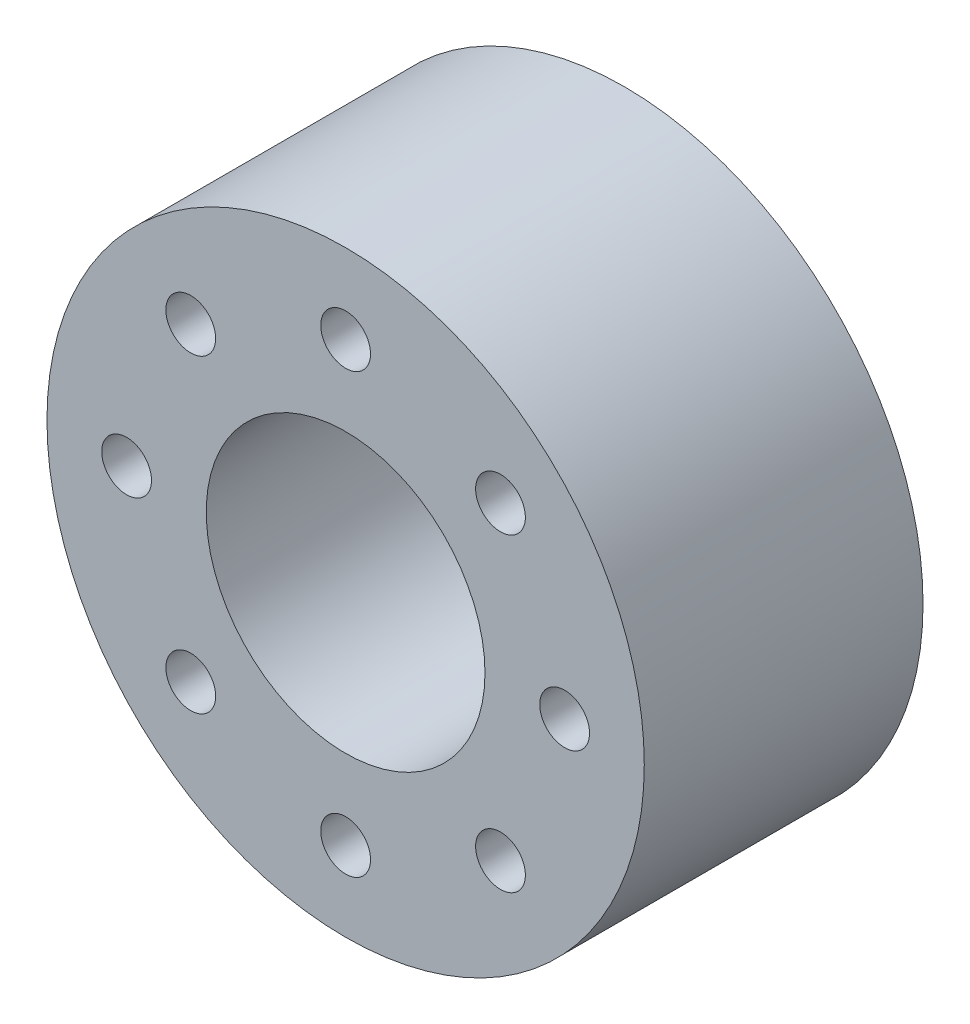
ISO-10303-21;
HEADER;
FILE_DESCRIPTION(('STEP AP214'),'2;1');
FILE_NAME('part.step','',(''),(''),'','','');
FILE_SCHEMA(('AUTOMOTIVE_DESIGN { 1 0 10303 214 1 1 1 1 }'));
ENDSEC;
DATA;
#1=APPLICATION_CONTEXT('core data for automotive mechanical design processes');
#2=APPLICATION_PROTOCOL_DEFINITION('international standard','automotive_design',2000,#1);
#3=PRODUCT_CONTEXT('',#1,'mechanical');
#4=PRODUCT('Part','Part','',(#3));
#5=PRODUCT_RELATED_PRODUCT_CATEGORY('part','',(#4));
#6=PRODUCT_DEFINITION_FORMATION('','',#4);
#7=PRODUCT_DEFINITION_CONTEXT('part definition',#1,'design');
#8=PRODUCT_DEFINITION('design','',#6,#7);
#9=PRODUCT_DEFINITION_SHAPE('','',#8);
#10=(LENGTH_UNIT() NAMED_UNIT(*) SI_UNIT(.MILLI.,.METRE.));
#11=(NAMED_UNIT(*) PLANE_ANGLE_UNIT() SI_UNIT($,.RADIAN.));
#12=(NAMED_UNIT(*) SI_UNIT($,.STERADIAN.) SOLID_ANGLE_UNIT());
#13=UNCERTAINTY_MEASURE_WITH_UNIT(LENGTH_MEASURE(1.E-05),#10,'distance_accuracy_value','');
#14=(GEOMETRIC_REPRESENTATION_CONTEXT(3) GLOBAL_UNCERTAINTY_ASSIGNED_CONTEXT((#13)) GLOBAL_UNIT_ASSIGNED_CONTEXT((#10,
#11,#12)) REPRESENTATION_CONTEXT('',''));
#15=CARTESIAN_POINT('',(0.,0.,0.));
#16=DIRECTION('',(0.,0.,1.));
#17=DIRECTION('',(1.,0.,0.));
#18=AXIS2_PLACEMENT_3D('',#15,#16,#17);
#19=CARTESIAN_POINT('',(0.,0.,7.));
#20=DIRECTION('',(0.,0.,1.));
#21=DIRECTION('',(1.,0.,0.));
#22=AXIS2_PLACEMENT_3D('',#19,#20,#21);
#23=PLANE('',#22);
#24=CARTESIAN_POINT('',(-11.,0.,7.));
#25=DIRECTION('',(0.,0.,1.));
#26=DIRECTION('',(1.,0.,0.));
#27=AXIS2_PLACEMENT_3D('',#24,#25,#26);
#28=CIRCLE('',#27,1.25000000000011);
#29=CARTESIAN_POINT('',(-9.74999999999989,0.,7.));
#30=VERTEX_POINT('',#29);
#31=EDGE_CURVE('E82',#30,#30,#28,.T.);
#32=ORIENTED_EDGE('',*,*,#31,.F.);
#33=EDGE_LOOP('',(#32));
#34=FACE_BOUND('',#33,.T.);
#35=CARTESIAN_POINT('',(0.,-11.,7.));
#36=DIRECTION('',(0.,0.,1.));
#37=DIRECTION('',(1.,0.,0.));
#38=AXIS2_PLACEMENT_3D('',#35,#36,#37);
#39=CIRCLE('',#38,1.25000000000007);
#40=CARTESIAN_POINT('',(1.25000000000007,-11.,7.));
#41=VERTEX_POINT('',#40);
#42=EDGE_CURVE('E70',#41,#41,#39,.T.);
#43=ORIENTED_EDGE('',*,*,#42,.F.);
#44=EDGE_LOOP('',(#43));
#45=FACE_BOUND('',#44,.T.);
#46=CARTESIAN_POINT('',(11.,0.,7.));
#47=DIRECTION('',(0.,0.,1.));
#48=DIRECTION('',(1.,0.,0.));
#49=AXIS2_PLACEMENT_3D('',#46,#47,#48);
#50=CIRCLE('',#49,1.25000000000004);
#51=CARTESIAN_POINT('',(12.25,0.,7.));
#52=VERTEX_POINT('',#51);
#53=EDGE_CURVE('E58',#52,#52,#50,.T.);
#54=ORIENTED_EDGE('',*,*,#53,.F.);
#55=EDGE_LOOP('',(#54));
#56=FACE_BOUND('',#55,.T.);
#57=CARTESIAN_POINT('',(0.,11.,7.));
#58=DIRECTION('',(0.,0.,1.));
#59=DIRECTION('',(1.,0.,0.));
#60=AXIS2_PLACEMENT_3D('',#57,#58,#59);
#61=CIRCLE('',#60,1.25);
#62=CARTESIAN_POINT('',(1.25,11.,7.));
#63=VERTEX_POINT('',#62);
#64=EDGE_CURVE('E46',#63,#63,#61,.T.);
#65=ORIENTED_EDGE('',*,*,#64,.F.);
#66=EDGE_LOOP('',(#65));
#67=FACE_BOUND('',#66,.T.);
#68=CARTESIAN_POINT('',(0.,0.,7.));
#69=DIRECTION('',(0.,0.,1.));
#70=DIRECTION('',(1.,0.,0.));
#71=AXIS2_PLACEMENT_3D('',#68,#69,#70);
#72=CIRCLE('',#71,15.);
#73=CARTESIAN_POINT('',(15.,0.,7.));
#74=VERTEX_POINT('',#73);
#75=EDGE_CURVE('E10',#74,#74,#72,.T.);
#76=ORIENTED_EDGE('',*,*,#75,.T.);
#77=EDGE_LOOP('',(#76));
#78=FACE_BOUND('',#77,.T.);
#79=CARTESIAN_POINT('',(0.,0.,7.));
#80=DIRECTION('',(0.,0.,1.));
#81=DIRECTION('',(1.,0.,0.));
#82=AXIS2_PLACEMENT_3D('',#79,#80,#81);
#83=CIRCLE('',#82,7.);
#84=CARTESIAN_POINT('',(7.,0.,7.));
#85=VERTEX_POINT('',#84);
#86=EDGE_CURVE('E41',#85,#85,#83,.T.);
#87=ORIENTED_EDGE('',*,*,#86,.F.);
#88=EDGE_LOOP('',(#87));
#89=FACE_BOUND('',#88,.T.);
#90=CARTESIAN_POINT('',(7.77817459305202,7.77817459305202,7.));
#91=DIRECTION('',(0.,0.,1.));
#92=DIRECTION('',(1.,0.,0.));
#93=AXIS2_PLACEMENT_3D('',#90,#91,#92);
#94=CIRCLE('',#93,1.25000000000002);
#95=CARTESIAN_POINT('',(9.02817459305204,7.77817459305202,7.));
#96=VERTEX_POINT('',#95);
#97=EDGE_CURVE('E52',#96,#96,#94,.T.);
#98=ORIENTED_EDGE('',*,*,#97,.F.);
#99=EDGE_LOOP('',(#98));
#100=FACE_BOUND('',#99,.T.);
#101=CARTESIAN_POINT('',(7.77817459305202,-7.77817459305202,7.));
#102=DIRECTION('',(0.,0.,1.));
#103=DIRECTION('',(1.,0.,0.));
#104=AXIS2_PLACEMENT_3D('',#101,#102,#103);
#105=CIRCLE('',#104,1.25000000000005);
#106=CARTESIAN_POINT('',(9.02817459305208,-7.77817459305202,7.));
#107=VERTEX_POINT('',#106);
#108=EDGE_CURVE('E64',#107,#107,#105,.T.);
#109=ORIENTED_EDGE('',*,*,#108,.F.);
#110=EDGE_LOOP('',(#109));
#111=FACE_BOUND('',#110,.T.);
#112=CARTESIAN_POINT('',(-7.77817459305202,-7.77817459305202,7.));
#113=DIRECTION('',(0.,0.,1.));
#114=DIRECTION('',(1.,0.,0.));
#115=AXIS2_PLACEMENT_3D('',#112,#113,#114);
#116=CIRCLE('',#115,1.25000000000009);
#117=CARTESIAN_POINT('',(-6.52817459305193,-7.77817459305202,7.));
#118=VERTEX_POINT('',#117);
#119=EDGE_CURVE('E76',#118,#118,#116,.T.);
#120=ORIENTED_EDGE('',*,*,#119,.F.);
#121=EDGE_LOOP('',(#120));
#122=FACE_BOUND('',#121,.T.);
#123=CARTESIAN_POINT('',(-7.77817459305202,7.77817459305202,7.));
#124=DIRECTION('',(0.,0.,1.));
#125=DIRECTION('',(1.,0.,0.));
#126=AXIS2_PLACEMENT_3D('',#123,#124,#125);
#127=CIRCLE('',#126,1.25000000000013);
#128=CARTESIAN_POINT('',(-6.52817459305189,7.77817459305202,7.));
#129=VERTEX_POINT('',#128);
#130=EDGE_CURVE('E88',#129,#129,#127,.T.);
#131=ORIENTED_EDGE('',*,*,#130,.F.);
#132=EDGE_LOOP('',(#131));
#133=FACE_BOUND('',#132,.T.);
#134=ADVANCED_FACE('F30',(#34,#45,#56,#67,#78,#89,#100,#111,#122,#133),#23,.T.);
#135=CARTESIAN_POINT('',(0.,0.,-7.));
#136=DIRECTION('',(0.,0.,1.));
#137=DIRECTION('',(1.,0.,0.));
#138=AXIS2_PLACEMENT_3D('',#135,#136,#137);
#139=PLANE('',#138);
#140=CARTESIAN_POINT('',(0.,0.,-7.));
#141=DIRECTION('',(0.,0.,1.));
#142=DIRECTION('',(1.,0.,0.));
#143=AXIS2_PLACEMENT_3D('',#140,#141,#142);
#144=CIRCLE('',#143,15.);
#145=CARTESIAN_POINT('',(15.,0.,-7.));
#146=VERTEX_POINT('',#145);
#147=EDGE_CURVE('E34',#146,#146,#144,.T.);
#148=ORIENTED_EDGE('',*,*,#147,.F.);
#149=EDGE_LOOP('',(#148));
#150=FACE_BOUND('',#149,.T.);
#151=CARTESIAN_POINT('',(0.,0.,-7.));
#152=DIRECTION('',(0.,0.,1.));
#153=DIRECTION('',(1.,0.,0.));
#154=AXIS2_PLACEMENT_3D('',#151,#152,#153);
#155=CIRCLE('',#154,7.);
#156=CARTESIAN_POINT('',(7.,0.,-7.));
#157=VERTEX_POINT('',#156);
#158=EDGE_CURVE('E43',#157,#157,#155,.T.);
#159=ORIENTED_EDGE('',*,*,#158,.T.);
#160=EDGE_LOOP('',(#159));
#161=FACE_BOUND('',#160,.T.);
#162=CARTESIAN_POINT('',(0.,11.,-7.));
#163=DIRECTION('',(0.,0.,1.));
#164=DIRECTION('',(1.,0.,0.));
#165=AXIS2_PLACEMENT_3D('',#162,#163,#164);
#166=CIRCLE('',#165,1.25);
#167=CARTESIAN_POINT('',(1.25,11.,-7.));
#168=VERTEX_POINT('',#167);
#169=EDGE_CURVE('E49',#168,#168,#166,.T.);
#170=ORIENTED_EDGE('',*,*,#169,.T.);
#171=EDGE_LOOP('',(#170));
#172=FACE_BOUND('',#171,.T.);
#173=CARTESIAN_POINT('',(7.77817459305202,7.77817459305202,-7.));
#174=DIRECTION('',(0.,0.,1.));
#175=DIRECTION('',(1.,0.,0.));
#176=AXIS2_PLACEMENT_3D('',#173,#174,#175);
#177=CIRCLE('',#176,1.25000000000002);
#178=CARTESIAN_POINT('',(9.02817459305204,7.77817459305202,-7.));
#179=VERTEX_POINT('',#178);
#180=EDGE_CURVE('E55',#179,#179,#177,.T.);
#181=ORIENTED_EDGE('',*,*,#180,.T.);
#182=EDGE_LOOP('',(#181));
#183=FACE_BOUND('',#182,.T.);
#184=CARTESIAN_POINT('',(11.,0.,-7.));
#185=DIRECTION('',(0.,0.,1.));
#186=DIRECTION('',(1.,0.,0.));
#187=AXIS2_PLACEMENT_3D('',#184,#185,#186);
#188=CIRCLE('',#187,1.25000000000004);
#189=CARTESIAN_POINT('',(12.25,0.,-7.));
#190=VERTEX_POINT('',#189);
#191=EDGE_CURVE('E61',#190,#190,#188,.T.);
#192=ORIENTED_EDGE('',*,*,#191,.T.);
#193=EDGE_LOOP('',(#192));
#194=FACE_BOUND('',#193,.T.);
#195=CARTESIAN_POINT('',(7.77817459305202,-7.77817459305202,-7.));
#196=DIRECTION('',(0.,0.,1.));
#197=DIRECTION('',(1.,0.,0.));
#198=AXIS2_PLACEMENT_3D('',#195,#196,#197);
#199=CIRCLE('',#198,1.25000000000005);
#200=CARTESIAN_POINT('',(9.02817459305208,-7.77817459305202,-7.));
#201=VERTEX_POINT('',#200);
#202=EDGE_CURVE('E67',#201,#201,#199,.T.);
#203=ORIENTED_EDGE('',*,*,#202,.T.);
#204=EDGE_LOOP('',(#203));
#205=FACE_BOUND('',#204,.T.);
#206=CARTESIAN_POINT('',(0.,-11.,-7.));
#207=DIRECTION('',(0.,0.,1.));
#208=DIRECTION('',(1.,0.,0.));
#209=AXIS2_PLACEMENT_3D('',#206,#207,#208);
#210=CIRCLE('',#209,1.25000000000007);
#211=CARTESIAN_POINT('',(1.25000000000007,-11.,-7.));
#212=VERTEX_POINT('',#211);
#213=EDGE_CURVE('E73',#212,#212,#210,.T.);
#214=ORIENTED_EDGE('',*,*,#213,.T.);
#215=EDGE_LOOP('',(#214));
#216=FACE_BOUND('',#215,.T.);
#217=CARTESIAN_POINT('',(-7.77817459305202,-7.77817459305202,-7.));
#218=DIRECTION('',(0.,0.,1.));
#219=DIRECTION('',(1.,0.,0.));
#220=AXIS2_PLACEMENT_3D('',#217,#218,#219);
#221=CIRCLE('',#220,1.25000000000009);
#222=CARTESIAN_POINT('',(-6.52817459305193,-7.77817459305202,-7.));
#223=VERTEX_POINT('',#222);
#224=EDGE_CURVE('E79',#223,#223,#221,.T.);
#225=ORIENTED_EDGE('',*,*,#224,.T.);
#226=EDGE_LOOP('',(#225));
#227=FACE_BOUND('',#226,.T.);
#228=CARTESIAN_POINT('',(-11.,0.,-7.));
#229=DIRECTION('',(0.,0.,1.));
#230=DIRECTION('',(1.,0.,0.));
#231=AXIS2_PLACEMENT_3D('',#228,#229,#230);
#232=CIRCLE('',#231,1.25000000000011);
#233=CARTESIAN_POINT('',(-9.74999999999989,0.,-7.));
#234=VERTEX_POINT('',#233);
#235=EDGE_CURVE('E85',#234,#234,#232,.T.);
#236=ORIENTED_EDGE('',*,*,#235,.T.);
#237=EDGE_LOOP('',(#236));
#238=FACE_BOUND('',#237,.T.);
#239=CARTESIAN_POINT('',(-7.77817459305202,7.77817459305202,-7.));
#240=DIRECTION('',(0.,0.,1.));
#241=DIRECTION('',(1.,0.,0.));
#242=AXIS2_PLACEMENT_3D('',#239,#240,#241);
#243=CIRCLE('',#242,1.25000000000013);
#244=CARTESIAN_POINT('',(-6.52817459305189,7.77817459305202,-7.));
#245=VERTEX_POINT('',#244);
#246=EDGE_CURVE('E91',#245,#245,#243,.T.);
#247=ORIENTED_EDGE('',*,*,#246,.T.);
#248=EDGE_LOOP('',(#247));
#249=FACE_BOUND('',#248,.T.);
#250=ADVANCED_FACE('F101',(#150,#161,#172,#183,#194,#205,#216,#227,#238,#249),#139,.F.);
#251=CARTESIAN_POINT('',(0.,0.,7.));
#252=DIRECTION('',(0.,0.,-1.));
#253=DIRECTION('',(-1.,0.,0.));
#254=AXIS2_PLACEMENT_3D('',#251,#252,#253);
#255=CYLINDRICAL_SURFACE('',#254,15.);
#256=ORIENTED_EDGE('',*,*,#75,.F.);
#257=EDGE_LOOP('',(#256));
#258=FACE_BOUND('',#257,.T.);
#259=ORIENTED_EDGE('',*,*,#147,.T.);
#260=EDGE_LOOP('',(#259));
#261=FACE_BOUND('',#260,.T.);
#262=ADVANCED_FACE('F32',(#258,#261),#255,.T.);
#263=CARTESIAN_POINT('',(0.,0.,7.));
#264=DIRECTION('',(0.,0.,-1.));
#265=DIRECTION('',(-1.,0.,0.));
#266=AXIS2_PLACEMENT_3D('',#263,#264,#265);
#267=CYLINDRICAL_SURFACE('',#266,7.);
#268=ORIENTED_EDGE('',*,*,#86,.T.);
#269=EDGE_LOOP('',(#268));
#270=FACE_BOUND('',#269,.T.);
#271=ORIENTED_EDGE('',*,*,#158,.F.);
#272=EDGE_LOOP('',(#271));
#273=FACE_BOUND('',#272,.T.);
#274=ADVANCED_FACE('F111',(#270,#273),#267,.F.);
#275=CARTESIAN_POINT('',(0.,11.,7.));
#276=DIRECTION('',(0.,0.,-1.));
#277=DIRECTION('',(-1.,0.,0.));
#278=AXIS2_PLACEMENT_3D('',#275,#276,#277);
#279=CYLINDRICAL_SURFACE('',#278,1.25);
#280=ORIENTED_EDGE('',*,*,#64,.T.);
#281=EDGE_LOOP('',(#280));
#282=FACE_BOUND('',#281,.T.);
#283=ORIENTED_EDGE('',*,*,#169,.F.);
#284=EDGE_LOOP('',(#283));
#285=FACE_BOUND('',#284,.T.);
#286=ADVANCED_FACE('F114',(#282,#285),#279,.F.);
#287=CARTESIAN_POINT('',(7.77817459305202,7.77817459305202,7.));
#288=DIRECTION('',(0.,0.,-1.));
#289=DIRECTION('',(-1.,0.,0.));
#290=AXIS2_PLACEMENT_3D('',#287,#288,#289);
#291=CYLINDRICAL_SURFACE('',#290,1.25000000000002);
#292=ORIENTED_EDGE('',*,*,#97,.T.);
#293=EDGE_LOOP('',(#292));
#294=FACE_BOUND('',#293,.T.);
#295=ORIENTED_EDGE('',*,*,#180,.F.);
#296=EDGE_LOOP('',(#295));
#297=FACE_BOUND('',#296,.T.);
#298=ADVANCED_FACE('F118',(#294,#297),#291,.F.);
#299=CARTESIAN_POINT('',(11.,0.,7.));
#300=DIRECTION('',(0.,0.,-1.));
#301=DIRECTION('',(-1.,0.,0.));
#302=AXIS2_PLACEMENT_3D('',#299,#300,#301);
#303=CYLINDRICAL_SURFACE('',#302,1.25000000000004);
#304=ORIENTED_EDGE('',*,*,#53,.T.);
#305=EDGE_LOOP('',(#304));
#306=FACE_BOUND('',#305,.T.);
#307=ORIENTED_EDGE('',*,*,#191,.F.);
#308=EDGE_LOOP('',(#307));
#309=FACE_BOUND('',#308,.T.);
#310=ADVANCED_FACE('F122',(#306,#309),#303,.F.);
#311=CARTESIAN_POINT('',(7.77817459305202,-7.77817459305202,7.));
#312=DIRECTION('',(0.,0.,-1.));
#313=DIRECTION('',(-1.,0.,0.));
#314=AXIS2_PLACEMENT_3D('',#311,#312,#313);
#315=CYLINDRICAL_SURFACE('',#314,1.25000000000005);
#316=ORIENTED_EDGE('',*,*,#108,.T.);
#317=EDGE_LOOP('',(#316));
#318=FACE_BOUND('',#317,.T.);
#319=ORIENTED_EDGE('',*,*,#202,.F.);
#320=EDGE_LOOP('',(#319));
#321=FACE_BOUND('',#320,.T.);
#322=ADVANCED_FACE('F126',(#318,#321),#315,.F.);
#323=CARTESIAN_POINT('',(0.,-11.,7.));
#324=DIRECTION('',(0.,0.,-1.));
#325=DIRECTION('',(-1.,0.,0.));
#326=AXIS2_PLACEMENT_3D('',#323,#324,#325);
#327=CYLINDRICAL_SURFACE('',#326,1.25000000000007);
#328=ORIENTED_EDGE('',*,*,#42,.T.);
#329=EDGE_LOOP('',(#328));
#330=FACE_BOUND('',#329,.T.);
#331=ORIENTED_EDGE('',*,*,#213,.F.);
#332=EDGE_LOOP('',(#331));
#333=FACE_BOUND('',#332,.T.);
#334=ADVANCED_FACE('F130',(#330,#333),#327,.F.);
#335=CARTESIAN_POINT('',(-7.77817459305202,-7.77817459305202,7.));
#336=DIRECTION('',(0.,0.,-1.));
#337=DIRECTION('',(-1.,0.,0.));
#338=AXIS2_PLACEMENT_3D('',#335,#336,#337);
#339=CYLINDRICAL_SURFACE('',#338,1.25000000000009);
#340=ORIENTED_EDGE('',*,*,#119,.T.);
#341=EDGE_LOOP('',(#340));
#342=FACE_BOUND('',#341,.T.);
#343=ORIENTED_EDGE('',*,*,#224,.F.);
#344=EDGE_LOOP('',(#343));
#345=FACE_BOUND('',#344,.T.);
#346=ADVANCED_FACE('F134',(#342,#345),#339,.F.);
#347=CARTESIAN_POINT('',(-11.,0.,7.));
#348=DIRECTION('',(0.,0.,-1.));
#349=DIRECTION('',(-1.,0.,0.));
#350=AXIS2_PLACEMENT_3D('',#347,#348,#349);
#351=CYLINDRICAL_SURFACE('',#350,1.25000000000011);
#352=ORIENTED_EDGE('',*,*,#31,.T.);
#353=EDGE_LOOP('',(#352));
#354=FACE_BOUND('',#353,.T.);
#355=ORIENTED_EDGE('',*,*,#235,.F.);
#356=EDGE_LOOP('',(#355));
#357=FACE_BOUND('',#356,.T.);
#358=ADVANCED_FACE('F138',(#354,#357),#351,.F.);
#359=CARTESIAN_POINT('',(-7.77817459305202,7.77817459305202,7.));
#360=DIRECTION('',(0.,0.,-1.));
#361=DIRECTION('',(-1.,0.,0.));
#362=AXIS2_PLACEMENT_3D('',#359,#360,#361);
#363=CYLINDRICAL_SURFACE('',#362,1.25000000000013);
#364=ORIENTED_EDGE('',*,*,#130,.T.);
#365=EDGE_LOOP('',(#364));
#366=FACE_BOUND('',#365,.T.);
#367=ORIENTED_EDGE('',*,*,#246,.F.);
#368=EDGE_LOOP('',(#367));
#369=FACE_BOUND('',#368,.T.);
#370=ADVANCED_FACE('F97',(#366,#369),#363,.F.);
#371=CLOSED_SHELL('',(#134,#250,#262,#274,#286,#298,#310,#322,#334,#346,#358,#370));
#372=MANIFOLD_SOLID_BREP('B2',#371);
#373=ADVANCED_BREP_SHAPE_REPRESENTATION('',(#18,#372),#14);
#374=SHAPE_DEFINITION_REPRESENTATION(#9,#373);
ENDSEC;
END-ISO-10303-21;
